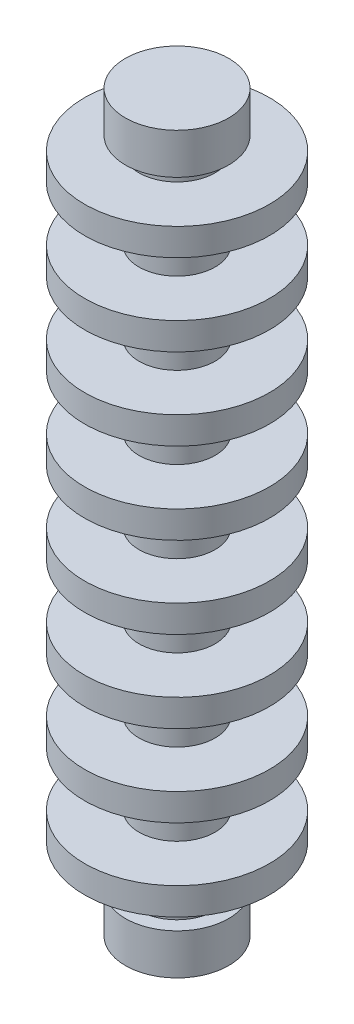
ISO-10303-21;
HEADER;
FILE_DESCRIPTION(('STEP AP214'),'2;1');
FILE_NAME('part.step','',(''),(''),'','','');
FILE_SCHEMA(('AUTOMOTIVE_DESIGN { 1 0 10303 214 1 1 1 1 }'));
ENDSEC;
DATA;
#1=APPLICATION_CONTEXT('core data for automotive mechanical design processes');
#2=APPLICATION_PROTOCOL_DEFINITION('international standard','automotive_design',2000,#1);
#3=PRODUCT_CONTEXT('',#1,'mechanical');
#4=PRODUCT('Part','Part','',(#3));
#5=PRODUCT_RELATED_PRODUCT_CATEGORY('part','',(#4));
#6=PRODUCT_DEFINITION_FORMATION('','',#4);
#7=PRODUCT_DEFINITION_CONTEXT('part definition',#1,'design');
#8=PRODUCT_DEFINITION('design','',#6,#7);
#9=PRODUCT_DEFINITION_SHAPE('','',#8);
#10=(LENGTH_UNIT() NAMED_UNIT(*) SI_UNIT(.MILLI.,.METRE.));
#11=(NAMED_UNIT(*) PLANE_ANGLE_UNIT() SI_UNIT($,.RADIAN.));
#12=(NAMED_UNIT(*) SI_UNIT($,.STERADIAN.) SOLID_ANGLE_UNIT());
#13=UNCERTAINTY_MEASURE_WITH_UNIT(LENGTH_MEASURE(1.E-05),#10,'distance_accuracy_value','');
#14=(GEOMETRIC_REPRESENTATION_CONTEXT(3) GLOBAL_UNCERTAINTY_ASSIGNED_CONTEXT((#13)) GLOBAL_UNIT_ASSIGNED_CONTEXT((#10,
#11,#12)) REPRESENTATION_CONTEXT('',''));
#15=CARTESIAN_POINT('',(0.,0.,0.));
#16=DIRECTION('',(0.,0.,1.));
#17=DIRECTION('',(1.,0.,0.));
#18=AXIS2_PLACEMENT_3D('',#15,#16,#17);
#19=CARTESIAN_POINT('',(3.8,27.,0.));
#20=DIRECTION('',(0.,-1.,0.));
#21=DIRECTION('',(1.,0.,0.));
#22=AXIS2_PLACEMENT_3D('',#19,#20,#21);
#23=PLANE('',#22);
#24=CARTESIAN_POINT('',(0.,27.,0.));
#25=DIRECTION('',(0.,1.,0.));
#26=DIRECTION('',(-1.,0.,0.));
#27=AXIS2_PLACEMENT_3D('',#24,#25,#26);
#28=CIRCLE('',#27,3.8);
#29=CARTESIAN_POINT('',(-3.8,27.,0.));
#30=VERTEX_POINT('',#29);
#31=EDGE_CURVE('E198',#30,#30,#28,.T.);
#32=ORIENTED_EDGE('',*,*,#31,.T.);
#33=EDGE_LOOP('',(#32));
#34=FACE_BOUND('',#33,.T.);
#35=ADVANCED_FACE('F43',(#34),#23,.F.);
#36=CARTESIAN_POINT('',(3.80000000000001,-27.,0.));
#37=DIRECTION('',(0.,1.,0.));
#38=DIRECTION('',(-1.,0.,0.));
#39=AXIS2_PLACEMENT_3D('',#36,#37,#38);
#40=PLANE('',#39);
#41=CARTESIAN_POINT('',(0.,-27.,0.));
#42=DIRECTION('',(0.,1.,0.));
#43=DIRECTION('',(-1.,0.,0.));
#44=AXIS2_PLACEMENT_3D('',#41,#42,#43);
#45=CIRCLE('',#44,3.8);
#46=CARTESIAN_POINT('',(-3.8,-27.,0.));
#47=VERTEX_POINT('',#46);
#48=EDGE_CURVE('E10',#47,#47,#45,.T.);
#49=ORIENTED_EDGE('',*,*,#48,.F.);
#50=EDGE_LOOP('',(#49));
#51=FACE_BOUND('',#50,.T.);
#52=ADVANCED_FACE('F421',(#51),#40,.F.);
#53=CARTESIAN_POINT('',(0.,27.,0.));
#54=DIRECTION('',(0.,1.,0.));
#55=DIRECTION('',(-1.,0.,0.));
#56=AXIS2_PLACEMENT_3D('',#53,#54,#55);
#57=CYLINDRICAL_SURFACE('',#56,3.8);
#58=CARTESIAN_POINT('',(0.,-24.,0.));
#59=DIRECTION('',(0.,1.,0.));
#60=DIRECTION('',(-1.,0.,0.));
#61=AXIS2_PLACEMENT_3D('',#58,#59,#60);
#62=CIRCLE('',#61,3.8);
#63=CARTESIAN_POINT('',(-3.8,-24.,0.));
#64=VERTEX_POINT('',#63);
#65=EDGE_CURVE('E50',#64,#64,#62,.T.);
#66=ORIENTED_EDGE('',*,*,#65,.F.);
#67=EDGE_LOOP('',(#66));
#68=FACE_BOUND('',#67,.T.);
#69=ORIENTED_EDGE('',*,*,#48,.T.);
#70=EDGE_LOOP('',(#69));
#71=FACE_BOUND('',#70,.T.);
#72=ADVANCED_FACE('F416',(#68,#71),#57,.T.);
#73=CARTESIAN_POINT('',(2.8,-24.,0.));
#74=DIRECTION('',(0.,-1.,0.));
#75=DIRECTION('',(1.,0.,0.));
#76=AXIS2_PLACEMENT_3D('',#73,#74,#75);
#77=PLANE('',#76);
#78=CARTESIAN_POINT('',(0.,-24.,0.));
#79=DIRECTION('',(0.,1.,0.));
#80=DIRECTION('',(-1.,0.,0.));
#81=AXIS2_PLACEMENT_3D('',#78,#79,#80);
#82=CIRCLE('',#81,2.8);
#83=CARTESIAN_POINT('',(-2.8,-24.,0.));
#84=VERTEX_POINT('',#83);
#85=EDGE_CURVE('E55',#84,#84,#82,.T.);
#86=ORIENTED_EDGE('',*,*,#85,.F.);
#87=EDGE_LOOP('',(#86));
#88=FACE_BOUND('',#87,.T.);
#89=ORIENTED_EDGE('',*,*,#65,.T.);
#90=EDGE_LOOP('',(#89));
#91=FACE_BOUND('',#90,.T.);
#92=ADVANCED_FACE('F411',(#88,#91),#77,.F.);
#93=CARTESIAN_POINT('',(0.,27.,0.));
#94=DIRECTION('',(0.,1.,0.));
#95=DIRECTION('',(-1.,0.,0.));
#96=AXIS2_PLACEMENT_3D('',#93,#94,#95);
#97=CYLINDRICAL_SURFACE('',#96,2.80000000000022);
#98=CARTESIAN_POINT('',(0.,-21.,0.));
#99=DIRECTION('',(0.,1.,0.));
#100=DIRECTION('',(-1.,0.,0.));
#101=AXIS2_PLACEMENT_3D('',#98,#99,#100);
#102=CIRCLE('',#101,2.80000000000043);
#103=CARTESIAN_POINT('',(-2.80000000000043,-21.,0.));
#104=VERTEX_POINT('',#103);
#105=EDGE_CURVE('E60',#104,#104,#102,.T.);
#106=ORIENTED_EDGE('',*,*,#105,.F.);
#107=EDGE_LOOP('',(#106));
#108=FACE_BOUND('',#107,.T.);
#109=ORIENTED_EDGE('',*,*,#85,.T.);
#110=EDGE_LOOP('',(#109));
#111=FACE_BOUND('',#110,.T.);
#112=ADVANCED_FACE('F405',(#108,#111),#97,.T.);
#113=CARTESIAN_POINT('',(6.80000000000044,-21.,0.));
#114=DIRECTION('',(0.,1.,0.));
#115=DIRECTION('',(-1.,0.,0.));
#116=AXIS2_PLACEMENT_3D('',#113,#114,#115);
#117=PLANE('',#116);
#118=CARTESIAN_POINT('',(0.,-21.,0.));
#119=DIRECTION('',(0.,1.,0.));
#120=DIRECTION('',(-1.,0.,0.));
#121=AXIS2_PLACEMENT_3D('',#118,#119,#120);
#122=CIRCLE('',#121,6.80000000000044);
#123=CARTESIAN_POINT('',(-6.80000000000044,-21.,0.));
#124=VERTEX_POINT('',#123);
#125=EDGE_CURVE('E66',#124,#124,#122,.T.);
#126=ORIENTED_EDGE('',*,*,#125,.F.);
#127=EDGE_LOOP('',(#126));
#128=FACE_BOUND('',#127,.T.);
#129=ORIENTED_EDGE('',*,*,#105,.T.);
#130=EDGE_LOOP('',(#129));
#131=FACE_BOUND('',#130,.T.);
#132=ADVANCED_FACE('F399',(#128,#131),#117,.F.);
#133=CARTESIAN_POINT('',(0.,27.,0.));
#134=DIRECTION('',(0.,1.,0.));
#135=DIRECTION('',(-1.,0.,0.));
#136=AXIS2_PLACEMENT_3D('',#133,#134,#135);
#137=CYLINDRICAL_SURFACE('',#136,6.80000000000044);
#138=CARTESIAN_POINT('',(0.,-19.,0.));
#139=DIRECTION('',(0.,1.,0.));
#140=DIRECTION('',(-1.,0.,0.));
#141=AXIS2_PLACEMENT_3D('',#138,#139,#140);
#142=CIRCLE('',#141,6.80000000000044);
#143=CARTESIAN_POINT('',(-6.80000000000043,-19.,0.));
#144=VERTEX_POINT('',#143);
#145=EDGE_CURVE('E70',#144,#144,#142,.T.);
#146=ORIENTED_EDGE('',*,*,#145,.F.);
#147=EDGE_LOOP('',(#146));
#148=FACE_BOUND('',#147,.T.);
#149=ORIENTED_EDGE('',*,*,#125,.T.);
#150=EDGE_LOOP('',(#149));
#151=FACE_BOUND('',#150,.T.);
#152=ADVANCED_FACE('F393',(#148,#151),#137,.T.);
#153=CARTESIAN_POINT('',(2.80000000000044,-19.,0.));
#154=DIRECTION('',(0.,-1.,0.));
#155=DIRECTION('',(1.,0.,0.));
#156=AXIS2_PLACEMENT_3D('',#153,#154,#155);
#157=PLANE('',#156);
#158=CARTESIAN_POINT('',(0.,-19.,0.));
#159=DIRECTION('',(0.,1.,0.));
#160=DIRECTION('',(-1.,0.,0.));
#161=AXIS2_PLACEMENT_3D('',#158,#159,#160);
#162=CIRCLE('',#161,2.80000000000043);
#163=CARTESIAN_POINT('',(-2.80000000000043,-19.,0.));
#164=VERTEX_POINT('',#163);
#165=EDGE_CURVE('E74',#164,#164,#162,.T.);
#166=ORIENTED_EDGE('',*,*,#165,.F.);
#167=EDGE_LOOP('',(#166));
#168=FACE_BOUND('',#167,.T.);
#169=ORIENTED_EDGE('',*,*,#145,.T.);
#170=EDGE_LOOP('',(#169));
#171=FACE_BOUND('',#170,.T.);
#172=ADVANCED_FACE('F387',(#168,#171),#157,.F.);
#173=CARTESIAN_POINT('',(0.,27.,0.));
#174=DIRECTION('',(0.,1.,0.));
#175=DIRECTION('',(-1.,0.,0.));
#176=AXIS2_PLACEMENT_3D('',#173,#174,#175);
#177=CYLINDRICAL_SURFACE('',#176,2.8000000000004);
#178=CARTESIAN_POINT('',(0.,-15.,0.));
#179=DIRECTION('',(0.,1.,0.));
#180=DIRECTION('',(-1.,0.,0.));
#181=AXIS2_PLACEMENT_3D('',#178,#179,#180);
#182=CIRCLE('',#181,2.80000000000037);
#183=CARTESIAN_POINT('',(-2.80000000000037,-15.,0.));
#184=VERTEX_POINT('',#183);
#185=EDGE_CURVE('E78',#184,#184,#182,.T.);
#186=ORIENTED_EDGE('',*,*,#185,.F.);
#187=EDGE_LOOP('',(#186));
#188=FACE_BOUND('',#187,.T.);
#189=ORIENTED_EDGE('',*,*,#165,.T.);
#190=EDGE_LOOP('',(#189));
#191=FACE_BOUND('',#190,.T.);
#192=ADVANCED_FACE('F381',(#188,#191),#177,.T.);
#193=CARTESIAN_POINT('',(6.80000000000038,-15.,0.));
#194=DIRECTION('',(0.,1.,0.));
#195=DIRECTION('',(-1.,0.,0.));
#196=AXIS2_PLACEMENT_3D('',#193,#194,#195);
#197=PLANE('',#196);
#198=CARTESIAN_POINT('',(0.,-15.,0.));
#199=DIRECTION('',(0.,1.,0.));
#200=DIRECTION('',(-1.,0.,0.));
#201=AXIS2_PLACEMENT_3D('',#198,#199,#200);
#202=CIRCLE('',#201,6.80000000000038);
#203=CARTESIAN_POINT('',(-6.80000000000037,-15.,0.));
#204=VERTEX_POINT('',#203);
#205=EDGE_CURVE('E82',#204,#204,#202,.T.);
#206=ORIENTED_EDGE('',*,*,#205,.F.);
#207=EDGE_LOOP('',(#206));
#208=FACE_BOUND('',#207,.T.);
#209=ORIENTED_EDGE('',*,*,#185,.T.);
#210=EDGE_LOOP('',(#209));
#211=FACE_BOUND('',#210,.T.);
#212=ADVANCED_FACE('F375',(#208,#211),#197,.F.);
#213=CARTESIAN_POINT('',(0.,27.,0.));
#214=DIRECTION('',(0.,1.,0.));
#215=DIRECTION('',(-1.,0.,0.));
#216=AXIS2_PLACEMENT_3D('',#213,#214,#215);
#217=CYLINDRICAL_SURFACE('',#216,6.80000000000038);
#218=CARTESIAN_POINT('',(0.,-13.,0.));
#219=DIRECTION('',(0.,1.,0.));
#220=DIRECTION('',(-1.,0.,0.));
#221=AXIS2_PLACEMENT_3D('',#218,#219,#220);
#222=CIRCLE('',#221,6.80000000000037);
#223=CARTESIAN_POINT('',(-6.80000000000037,-13.,0.));
#224=VERTEX_POINT('',#223);
#225=EDGE_CURVE('E86',#224,#224,#222,.T.);
#226=ORIENTED_EDGE('',*,*,#225,.F.);
#227=EDGE_LOOP('',(#226));
#228=FACE_BOUND('',#227,.T.);
#229=ORIENTED_EDGE('',*,*,#205,.T.);
#230=EDGE_LOOP('',(#229));
#231=FACE_BOUND('',#230,.T.);
#232=ADVANCED_FACE('F369',(#228,#231),#217,.T.);
#233=CARTESIAN_POINT('',(2.80000000000037,-13.,0.));
#234=DIRECTION('',(0.,-1.,0.));
#235=DIRECTION('',(1.,0.,0.));
#236=AXIS2_PLACEMENT_3D('',#233,#234,#235);
#237=PLANE('',#236);
#238=CARTESIAN_POINT('',(0.,-13.,0.));
#239=DIRECTION('',(0.,1.,0.));
#240=DIRECTION('',(-1.,0.,0.));
#241=AXIS2_PLACEMENT_3D('',#238,#239,#240);
#242=CIRCLE('',#241,2.80000000000037);
#243=CARTESIAN_POINT('',(-2.80000000000037,-13.,0.));
#244=VERTEX_POINT('',#243);
#245=EDGE_CURVE('E90',#244,#244,#242,.T.);
#246=ORIENTED_EDGE('',*,*,#245,.F.);
#247=EDGE_LOOP('',(#246));
#248=FACE_BOUND('',#247,.T.);
#249=ORIENTED_EDGE('',*,*,#225,.T.);
#250=EDGE_LOOP('',(#249));
#251=FACE_BOUND('',#250,.T.);
#252=ADVANCED_FACE('F363',(#248,#251),#237,.F.);
#253=CARTESIAN_POINT('',(0.,27.,0.));
#254=DIRECTION('',(0.,1.,0.));
#255=DIRECTION('',(-1.,0.,0.));
#256=AXIS2_PLACEMENT_3D('',#253,#254,#255);
#257=CYLINDRICAL_SURFACE('',#256,2.80000000000034);
#258=CARTESIAN_POINT('',(0.,-9.,0.));
#259=DIRECTION('',(0.,1.,0.));
#260=DIRECTION('',(-1.,0.,0.));
#261=AXIS2_PLACEMENT_3D('',#258,#259,#260);
#262=CIRCLE('',#261,2.80000000000031);
#263=CARTESIAN_POINT('',(-2.80000000000031,-9.,0.));
#264=VERTEX_POINT('',#263);
#265=EDGE_CURVE('E94',#264,#264,#262,.T.);
#266=ORIENTED_EDGE('',*,*,#265,.F.);
#267=EDGE_LOOP('',(#266));
#268=FACE_BOUND('',#267,.T.);
#269=ORIENTED_EDGE('',*,*,#245,.T.);
#270=EDGE_LOOP('',(#269));
#271=FACE_BOUND('',#270,.T.);
#272=ADVANCED_FACE('F357',(#268,#271),#257,.T.);
#273=CARTESIAN_POINT('',(6.80000000000032,-9.,0.));
#274=DIRECTION('',(0.,1.,0.));
#275=DIRECTION('',(-1.,0.,0.));
#276=AXIS2_PLACEMENT_3D('',#273,#274,#275);
#277=PLANE('',#276);
#278=CARTESIAN_POINT('',(0.,-9.,0.));
#279=DIRECTION('',(0.,1.,0.));
#280=DIRECTION('',(-1.,0.,0.));
#281=AXIS2_PLACEMENT_3D('',#278,#279,#280);
#282=CIRCLE('',#281,6.80000000000031);
#283=CARTESIAN_POINT('',(-6.80000000000031,-9.,0.));
#284=VERTEX_POINT('',#283);
#285=EDGE_CURVE('E98',#284,#284,#282,.T.);
#286=ORIENTED_EDGE('',*,*,#285,.F.);
#287=EDGE_LOOP('',(#286));
#288=FACE_BOUND('',#287,.T.);
#289=ORIENTED_EDGE('',*,*,#265,.T.);
#290=EDGE_LOOP('',(#289));
#291=FACE_BOUND('',#290,.T.);
#292=ADVANCED_FACE('F351',(#288,#291),#277,.F.);
#293=CARTESIAN_POINT('',(0.,27.,0.));
#294=DIRECTION('',(0.,1.,0.));
#295=DIRECTION('',(-1.,0.,0.));
#296=AXIS2_PLACEMENT_3D('',#293,#294,#295);
#297=CYLINDRICAL_SURFACE('',#296,6.80000000000031);
#298=CARTESIAN_POINT('',(0.,-7.,0.));
#299=DIRECTION('',(0.,1.,0.));
#300=DIRECTION('',(-1.,0.,0.));
#301=AXIS2_PLACEMENT_3D('',#298,#299,#300);
#302=CIRCLE('',#301,6.80000000000031);
#303=CARTESIAN_POINT('',(-6.80000000000031,-7.,0.));
#304=VERTEX_POINT('',#303);
#305=EDGE_CURVE('E102',#304,#304,#302,.T.);
#306=ORIENTED_EDGE('',*,*,#305,.F.);
#307=EDGE_LOOP('',(#306));
#308=FACE_BOUND('',#307,.T.);
#309=ORIENTED_EDGE('',*,*,#285,.T.);
#310=EDGE_LOOP('',(#309));
#311=FACE_BOUND('',#310,.T.);
#312=ADVANCED_FACE('F345',(#308,#311),#297,.T.);
#313=CARTESIAN_POINT('',(2.80000000000031,-7.,0.));
#314=DIRECTION('',(0.,-1.,0.));
#315=DIRECTION('',(1.,0.,0.));
#316=AXIS2_PLACEMENT_3D('',#313,#314,#315);
#317=PLANE('',#316);
#318=CARTESIAN_POINT('',(0.,-7.,0.));
#319=DIRECTION('',(0.,1.,0.));
#320=DIRECTION('',(-1.,0.,0.));
#321=AXIS2_PLACEMENT_3D('',#318,#319,#320);
#322=CIRCLE('',#321,2.80000000000031);
#323=CARTESIAN_POINT('',(-2.80000000000031,-7.,0.));
#324=VERTEX_POINT('',#323);
#325=EDGE_CURVE('E106',#324,#324,#322,.T.);
#326=ORIENTED_EDGE('',*,*,#325,.F.);
#327=EDGE_LOOP('',(#326));
#328=FACE_BOUND('',#327,.T.);
#329=ORIENTED_EDGE('',*,*,#305,.T.);
#330=EDGE_LOOP('',(#329));
#331=FACE_BOUND('',#330,.T.);
#332=ADVANCED_FACE('F339',(#328,#331),#317,.F.);
#333=CARTESIAN_POINT('',(0.,27.,0.));
#334=DIRECTION('',(0.,1.,0.));
#335=DIRECTION('',(-1.,0.,0.));
#336=AXIS2_PLACEMENT_3D('',#333,#334,#335);
#337=CYLINDRICAL_SURFACE('',#336,2.80000000000028);
#338=CARTESIAN_POINT('',(0.,-3.,0.));
#339=DIRECTION('',(0.,1.,0.));
#340=DIRECTION('',(-1.,0.,0.));
#341=AXIS2_PLACEMENT_3D('',#338,#339,#340);
#342=CIRCLE('',#341,2.80000000000025);
#343=CARTESIAN_POINT('',(-2.80000000000025,-3.,0.));
#344=VERTEX_POINT('',#343);
#345=EDGE_CURVE('E110',#344,#344,#342,.T.);
#346=ORIENTED_EDGE('',*,*,#345,.F.);
#347=EDGE_LOOP('',(#346));
#348=FACE_BOUND('',#347,.T.);
#349=ORIENTED_EDGE('',*,*,#325,.T.);
#350=EDGE_LOOP('',(#349));
#351=FACE_BOUND('',#350,.T.);
#352=ADVANCED_FACE('F333',(#348,#351),#337,.T.);
#353=CARTESIAN_POINT('',(6.80000000000025,-3.,0.));
#354=DIRECTION('',(0.,1.,0.));
#355=DIRECTION('',(-1.,0.,0.));
#356=AXIS2_PLACEMENT_3D('',#353,#354,#355);
#357=PLANE('',#356);
#358=CARTESIAN_POINT('',(0.,-3.,0.));
#359=DIRECTION('',(0.,1.,0.));
#360=DIRECTION('',(-1.,0.,0.));
#361=AXIS2_PLACEMENT_3D('',#358,#359,#360);
#362=CIRCLE('',#361,6.80000000000025);
#363=CARTESIAN_POINT('',(-6.80000000000025,-3.,0.));
#364=VERTEX_POINT('',#363);
#365=EDGE_CURVE('E114',#364,#364,#362,.T.);
#366=ORIENTED_EDGE('',*,*,#365,.F.);
#367=EDGE_LOOP('',(#366));
#368=FACE_BOUND('',#367,.T.);
#369=ORIENTED_EDGE('',*,*,#345,.T.);
#370=EDGE_LOOP('',(#369));
#371=FACE_BOUND('',#370,.T.);
#372=ADVANCED_FACE('F327',(#368,#371),#357,.F.);
#373=CARTESIAN_POINT('',(0.,27.,0.));
#374=DIRECTION('',(0.,1.,0.));
#375=DIRECTION('',(-1.,0.,0.));
#376=AXIS2_PLACEMENT_3D('',#373,#374,#375);
#377=CYLINDRICAL_SURFACE('',#376,6.80000000000025);
#378=CARTESIAN_POINT('',(0.,-1.,0.));
#379=DIRECTION('',(0.,1.,0.));
#380=DIRECTION('',(-1.,0.,0.));
#381=AXIS2_PLACEMENT_3D('',#378,#379,#380);
#382=CIRCLE('',#381,6.80000000000025);
#383=CARTESIAN_POINT('',(-6.80000000000025,-1.,0.));
#384=VERTEX_POINT('',#383);
#385=EDGE_CURVE('E118',#384,#384,#382,.T.);
#386=ORIENTED_EDGE('',*,*,#385,.F.);
#387=EDGE_LOOP('',(#386));
#388=FACE_BOUND('',#387,.T.);
#389=ORIENTED_EDGE('',*,*,#365,.T.);
#390=EDGE_LOOP('',(#389));
#391=FACE_BOUND('',#390,.T.);
#392=ADVANCED_FACE('F321',(#388,#391),#377,.T.);
#393=CARTESIAN_POINT('',(2.80000000000025,-1.,0.));
#394=DIRECTION('',(0.,-1.,0.));
#395=DIRECTION('',(1.,0.,0.));
#396=AXIS2_PLACEMENT_3D('',#393,#394,#395);
#397=PLANE('',#396);
#398=CARTESIAN_POINT('',(0.,-1.,0.));
#399=DIRECTION('',(0.,1.,0.));
#400=DIRECTION('',(-1.,0.,0.));
#401=AXIS2_PLACEMENT_3D('',#398,#399,#400);
#402=CIRCLE('',#401,2.80000000000025);
#403=CARTESIAN_POINT('',(-2.80000000000025,-1.,0.));
#404=VERTEX_POINT('',#403);
#405=EDGE_CURVE('E122',#404,#404,#402,.T.);
#406=ORIENTED_EDGE('',*,*,#405,.F.);
#407=EDGE_LOOP('',(#406));
#408=FACE_BOUND('',#407,.T.);
#409=ORIENTED_EDGE('',*,*,#385,.T.);
#410=EDGE_LOOP('',(#409));
#411=FACE_BOUND('',#410,.T.);
#412=ADVANCED_FACE('F315',(#408,#411),#397,.F.);
#413=CARTESIAN_POINT('',(0.,27.,0.));
#414=DIRECTION('',(0.,1.,0.));
#415=DIRECTION('',(-1.,0.,0.));
#416=AXIS2_PLACEMENT_3D('',#413,#414,#415);
#417=CYLINDRICAL_SURFACE('',#416,2.80000000000022);
#418=CARTESIAN_POINT('',(0.,3.,0.));
#419=DIRECTION('',(0.,1.,0.));
#420=DIRECTION('',(-1.,0.,0.));
#421=AXIS2_PLACEMENT_3D('',#418,#419,#420);
#422=CIRCLE('',#421,2.80000000000019);
#423=CARTESIAN_POINT('',(-2.80000000000018,3.,0.));
#424=VERTEX_POINT('',#423);
#425=EDGE_CURVE('E126',#424,#424,#422,.T.);
#426=ORIENTED_EDGE('',*,*,#425,.F.);
#427=EDGE_LOOP('',(#426));
#428=FACE_BOUND('',#427,.T.);
#429=ORIENTED_EDGE('',*,*,#405,.T.);
#430=EDGE_LOOP('',(#429));
#431=FACE_BOUND('',#430,.T.);
#432=ADVANCED_FACE('F309',(#428,#431),#417,.T.);
#433=CARTESIAN_POINT('',(6.80000000000019,3.,0.));
#434=DIRECTION('',(0.,1.,0.));
#435=DIRECTION('',(-1.,0.,0.));
#436=AXIS2_PLACEMENT_3D('',#433,#434,#435);
#437=PLANE('',#436);
#438=CARTESIAN_POINT('',(0.,3.,0.));
#439=DIRECTION('',(0.,1.,0.));
#440=DIRECTION('',(-1.,0.,0.));
#441=AXIS2_PLACEMENT_3D('',#438,#439,#440);
#442=CIRCLE('',#441,6.80000000000019);
#443=CARTESIAN_POINT('',(-6.80000000000019,3.,0.));
#444=VERTEX_POINT('',#443);
#445=EDGE_CURVE('E130',#444,#444,#442,.T.);
#446=ORIENTED_EDGE('',*,*,#445,.F.);
#447=EDGE_LOOP('',(#446));
#448=FACE_BOUND('',#447,.T.);
#449=ORIENTED_EDGE('',*,*,#425,.T.);
#450=EDGE_LOOP('',(#449));
#451=FACE_BOUND('',#450,.T.);
#452=ADVANCED_FACE('F303',(#448,#451),#437,.F.);
#453=CARTESIAN_POINT('',(0.,27.,0.));
#454=DIRECTION('',(0.,1.,0.));
#455=DIRECTION('',(-1.,0.,0.));
#456=AXIS2_PLACEMENT_3D('',#453,#454,#455);
#457=CYLINDRICAL_SURFACE('',#456,6.80000000000019);
#458=CARTESIAN_POINT('',(0.,5.,0.));
#459=DIRECTION('',(0.,1.,0.));
#460=DIRECTION('',(-1.,0.,0.));
#461=AXIS2_PLACEMENT_3D('',#458,#459,#460);
#462=CIRCLE('',#461,6.80000000000019);
#463=CARTESIAN_POINT('',(-6.80000000000019,5.,0.));
#464=VERTEX_POINT('',#463);
#465=EDGE_CURVE('E134',#464,#464,#462,.T.);
#466=ORIENTED_EDGE('',*,*,#465,.F.);
#467=EDGE_LOOP('',(#466));
#468=FACE_BOUND('',#467,.T.);
#469=ORIENTED_EDGE('',*,*,#445,.T.);
#470=EDGE_LOOP('',(#469));
#471=FACE_BOUND('',#470,.T.);
#472=ADVANCED_FACE('F297',(#468,#471),#457,.T.);
#473=CARTESIAN_POINT('',(2.80000000000019,5.,0.));
#474=DIRECTION('',(0.,-1.,0.));
#475=DIRECTION('',(1.,0.,0.));
#476=AXIS2_PLACEMENT_3D('',#473,#474,#475);
#477=PLANE('',#476);
#478=CARTESIAN_POINT('',(0.,5.,0.));
#479=DIRECTION('',(0.,1.,0.));
#480=DIRECTION('',(-1.,0.,0.));
#481=AXIS2_PLACEMENT_3D('',#478,#479,#480);
#482=CIRCLE('',#481,2.80000000000019);
#483=CARTESIAN_POINT('',(-2.80000000000018,5.,0.));
#484=VERTEX_POINT('',#483);
#485=EDGE_CURVE('E138',#484,#484,#482,.T.);
#486=ORIENTED_EDGE('',*,*,#485,.F.);
#487=EDGE_LOOP('',(#486));
#488=FACE_BOUND('',#487,.T.);
#489=ORIENTED_EDGE('',*,*,#465,.T.);
#490=EDGE_LOOP('',(#489));
#491=FACE_BOUND('',#490,.T.);
#492=ADVANCED_FACE('F291',(#488,#491),#477,.F.);
#493=CARTESIAN_POINT('',(0.,27.,0.));
#494=DIRECTION('',(0.,1.,0.));
#495=DIRECTION('',(-1.,0.,0.));
#496=AXIS2_PLACEMENT_3D('',#493,#494,#495);
#497=CYLINDRICAL_SURFACE('',#496,2.80000000000015);
#498=CARTESIAN_POINT('',(0.,8.99999999999999,0.));
#499=DIRECTION('',(0.,1.,0.));
#500=DIRECTION('',(-1.,0.,0.));
#501=AXIS2_PLACEMENT_3D('',#498,#499,#500);
#502=CIRCLE('',#501,2.80000000000012);
#503=CARTESIAN_POINT('',(-2.80000000000012,8.99999999999999,0.));
#504=VERTEX_POINT('',#503);
#505=EDGE_CURVE('E142',#504,#504,#502,.T.);
#506=ORIENTED_EDGE('',*,*,#505,.F.);
#507=EDGE_LOOP('',(#506));
#508=FACE_BOUND('',#507,.T.);
#509=ORIENTED_EDGE('',*,*,#485,.T.);
#510=EDGE_LOOP('',(#509));
#511=FACE_BOUND('',#510,.T.);
#512=ADVANCED_FACE('F285',(#508,#511),#497,.T.);
#513=CARTESIAN_POINT('',(6.80000000000013,9.,0.));
#514=DIRECTION('',(0.,1.,0.));
#515=DIRECTION('',(-1.,0.,0.));
#516=AXIS2_PLACEMENT_3D('',#513,#514,#515);
#517=PLANE('',#516);
#518=CARTESIAN_POINT('',(0.,9.,0.));
#519=DIRECTION('',(0.,1.,0.));
#520=DIRECTION('',(-1.,0.,0.));
#521=AXIS2_PLACEMENT_3D('',#518,#519,#520);
#522=CIRCLE('',#521,6.80000000000013);
#523=CARTESIAN_POINT('',(-6.80000000000013,9.,0.));
#524=VERTEX_POINT('',#523);
#525=EDGE_CURVE('E146',#524,#524,#522,.T.);
#526=ORIENTED_EDGE('',*,*,#525,.F.);
#527=EDGE_LOOP('',(#526));
#528=FACE_BOUND('',#527,.T.);
#529=ORIENTED_EDGE('',*,*,#505,.T.);
#530=EDGE_LOOP('',(#529));
#531=FACE_BOUND('',#530,.T.);
#532=ADVANCED_FACE('F279',(#528,#531),#517,.F.);
#533=CARTESIAN_POINT('',(0.,27.,0.));
#534=DIRECTION('',(0.,1.,0.));
#535=DIRECTION('',(-1.,0.,0.));
#536=AXIS2_PLACEMENT_3D('',#533,#534,#535);
#537=CYLINDRICAL_SURFACE('',#536,6.80000000000013);
#538=CARTESIAN_POINT('',(0.,11.,0.));
#539=DIRECTION('',(0.,1.,0.));
#540=DIRECTION('',(-1.,0.,0.));
#541=AXIS2_PLACEMENT_3D('',#538,#539,#540);
#542=CIRCLE('',#541,6.80000000000013);
#543=CARTESIAN_POINT('',(-6.80000000000013,11.,0.));
#544=VERTEX_POINT('',#543);
#545=EDGE_CURVE('E150',#544,#544,#542,.T.);
#546=ORIENTED_EDGE('',*,*,#545,.F.);
#547=EDGE_LOOP('',(#546));
#548=FACE_BOUND('',#547,.T.);
#549=ORIENTED_EDGE('',*,*,#525,.T.);
#550=EDGE_LOOP('',(#549));
#551=FACE_BOUND('',#550,.T.);
#552=ADVANCED_FACE('F273',(#548,#551),#537,.T.);
#553=CARTESIAN_POINT('',(2.80000000000012,11.,0.));
#554=DIRECTION('',(0.,-1.,0.));
#555=DIRECTION('',(1.,0.,0.));
#556=AXIS2_PLACEMENT_3D('',#553,#554,#555);
#557=PLANE('',#556);
#558=CARTESIAN_POINT('',(0.,11.,0.));
#559=DIRECTION('',(0.,1.,0.));
#560=DIRECTION('',(-1.,0.,0.));
#561=AXIS2_PLACEMENT_3D('',#558,#559,#560);
#562=CIRCLE('',#561,2.80000000000012);
#563=CARTESIAN_POINT('',(-2.80000000000012,11.,0.));
#564=VERTEX_POINT('',#563);
#565=EDGE_CURVE('E154',#564,#564,#562,.T.);
#566=ORIENTED_EDGE('',*,*,#565,.F.);
#567=EDGE_LOOP('',(#566));
#568=FACE_BOUND('',#567,.T.);
#569=ORIENTED_EDGE('',*,*,#545,.T.);
#570=EDGE_LOOP('',(#569));
#571=FACE_BOUND('',#570,.T.);
#572=ADVANCED_FACE('F267',(#568,#571),#557,.F.);
#573=CARTESIAN_POINT('',(0.,27.,0.));
#574=DIRECTION('',(0.,1.,0.));
#575=DIRECTION('',(-1.,0.,0.));
#576=AXIS2_PLACEMENT_3D('',#573,#574,#575);
#577=CYLINDRICAL_SURFACE('',#576,2.80000000000009);
#578=CARTESIAN_POINT('',(0.,15.,0.));
#579=DIRECTION('',(0.,1.,0.));
#580=DIRECTION('',(-1.,0.,0.));
#581=AXIS2_PLACEMENT_3D('',#578,#579,#580);
#582=CIRCLE('',#581,2.80000000000006);
#583=CARTESIAN_POINT('',(-2.80000000000006,15.,0.));
#584=VERTEX_POINT('',#583);
#585=EDGE_CURVE('E158',#584,#584,#582,.T.);
#586=ORIENTED_EDGE('',*,*,#585,.F.);
#587=EDGE_LOOP('',(#586));
#588=FACE_BOUND('',#587,.T.);
#589=ORIENTED_EDGE('',*,*,#565,.T.);
#590=EDGE_LOOP('',(#589));
#591=FACE_BOUND('',#590,.T.);
#592=ADVANCED_FACE('F261',(#588,#591),#577,.T.);
#593=CARTESIAN_POINT('',(6.80000000000007,15.,0.));
#594=DIRECTION('',(0.,1.,0.));
#595=DIRECTION('',(-1.,0.,0.));
#596=AXIS2_PLACEMENT_3D('',#593,#594,#595);
#597=PLANE('',#596);
#598=CARTESIAN_POINT('',(0.,15.,0.));
#599=DIRECTION('',(0.,1.,0.));
#600=DIRECTION('',(-1.,0.,0.));
#601=AXIS2_PLACEMENT_3D('',#598,#599,#600);
#602=CIRCLE('',#601,6.80000000000007);
#603=CARTESIAN_POINT('',(-6.80000000000006,15.,0.));
#604=VERTEX_POINT('',#603);
#605=EDGE_CURVE('E162',#604,#604,#602,.T.);
#606=ORIENTED_EDGE('',*,*,#605,.F.);
#607=EDGE_LOOP('',(#606));
#608=FACE_BOUND('',#607,.T.);
#609=ORIENTED_EDGE('',*,*,#585,.T.);
#610=EDGE_LOOP('',(#609));
#611=FACE_BOUND('',#610,.T.);
#612=ADVANCED_FACE('F255',(#608,#611),#597,.F.);
#613=CARTESIAN_POINT('',(0.,27.,0.));
#614=DIRECTION('',(0.,1.,0.));
#615=DIRECTION('',(-1.,0.,0.));
#616=AXIS2_PLACEMENT_3D('',#613,#614,#615);
#617=CYLINDRICAL_SURFACE('',#616,6.80000000000006);
#618=CARTESIAN_POINT('',(0.,17.,0.));
#619=DIRECTION('',(0.,1.,0.));
#620=DIRECTION('',(-1.,0.,0.));
#621=AXIS2_PLACEMENT_3D('',#618,#619,#620);
#622=CIRCLE('',#621,6.80000000000006);
#623=CARTESIAN_POINT('',(-6.80000000000006,17.,0.));
#624=VERTEX_POINT('',#623);
#625=EDGE_CURVE('E166',#624,#624,#622,.T.);
#626=ORIENTED_EDGE('',*,*,#625,.F.);
#627=EDGE_LOOP('',(#626));
#628=FACE_BOUND('',#627,.T.);
#629=ORIENTED_EDGE('',*,*,#605,.T.);
#630=EDGE_LOOP('',(#629));
#631=FACE_BOUND('',#630,.T.);
#632=ADVANCED_FACE('F249',(#628,#631),#617,.T.);
#633=CARTESIAN_POINT('',(2.80000000000006,17.,0.));
#634=DIRECTION('',(0.,-1.,0.));
#635=DIRECTION('',(1.,0.,0.));
#636=AXIS2_PLACEMENT_3D('',#633,#634,#635);
#637=PLANE('',#636);
#638=CARTESIAN_POINT('',(0.,17.,0.));
#639=DIRECTION('',(0.,1.,0.));
#640=DIRECTION('',(-1.,0.,0.));
#641=AXIS2_PLACEMENT_3D('',#638,#639,#640);
#642=CIRCLE('',#641,2.80000000000006);
#643=CARTESIAN_POINT('',(-2.80000000000006,17.,0.));
#644=VERTEX_POINT('',#643);
#645=EDGE_CURVE('E170',#644,#644,#642,.T.);
#646=ORIENTED_EDGE('',*,*,#645,.F.);
#647=EDGE_LOOP('',(#646));
#648=FACE_BOUND('',#647,.T.);
#649=ORIENTED_EDGE('',*,*,#625,.T.);
#650=EDGE_LOOP('',(#649));
#651=FACE_BOUND('',#650,.T.);
#652=ADVANCED_FACE('F243',(#648,#651),#637,.F.);
#653=CARTESIAN_POINT('',(0.,27.,0.));
#654=DIRECTION('',(0.,1.,0.));
#655=DIRECTION('',(-1.,0.,0.));
#656=AXIS2_PLACEMENT_3D('',#653,#654,#655);
#657=CYLINDRICAL_SURFACE('',#656,2.79999999999978);
#658=CARTESIAN_POINT('',(0.,21.,0.));
#659=DIRECTION('',(0.,1.,0.));
#660=DIRECTION('',(-1.,0.,0.));
#661=AXIS2_PLACEMENT_3D('',#658,#659,#660);
#662=CIRCLE('',#661,2.8);
#663=CARTESIAN_POINT('',(-2.8,21.,0.));
#664=VERTEX_POINT('',#663);
#665=EDGE_CURVE('E174',#664,#664,#662,.T.);
#666=ORIENTED_EDGE('',*,*,#665,.F.);
#667=EDGE_LOOP('',(#666));
#668=FACE_BOUND('',#667,.T.);
#669=ORIENTED_EDGE('',*,*,#645,.T.);
#670=EDGE_LOOP('',(#669));
#671=FACE_BOUND('',#670,.T.);
#672=ADVANCED_FACE('F237',(#668,#671),#657,.T.);
#673=CARTESIAN_POINT('',(6.8,21.,0.));
#674=DIRECTION('',(0.,1.,0.));
#675=DIRECTION('',(-1.,0.,0.));
#676=AXIS2_PLACEMENT_3D('',#673,#674,#675);
#677=PLANE('',#676);
#678=CARTESIAN_POINT('',(0.,21.,0.));
#679=DIRECTION('',(0.,1.,0.));
#680=DIRECTION('',(-1.,0.,0.));
#681=AXIS2_PLACEMENT_3D('',#678,#679,#680);
#682=CIRCLE('',#681,6.8);
#683=CARTESIAN_POINT('',(-6.8,21.,0.));
#684=VERTEX_POINT('',#683);
#685=EDGE_CURVE('E178',#684,#684,#682,.T.);
#686=ORIENTED_EDGE('',*,*,#685,.F.);
#687=EDGE_LOOP('',(#686));
#688=FACE_BOUND('',#687,.T.);
#689=ORIENTED_EDGE('',*,*,#665,.T.);
#690=EDGE_LOOP('',(#689));
#691=FACE_BOUND('',#690,.T.);
#692=ADVANCED_FACE('F231',(#688,#691),#677,.F.);
#693=CARTESIAN_POINT('',(0.,27.,0.));
#694=DIRECTION('',(0.,1.,0.));
#695=DIRECTION('',(-1.,0.,0.));
#696=AXIS2_PLACEMENT_3D('',#693,#694,#695);
#697=CYLINDRICAL_SURFACE('',#696,6.8);
#698=CARTESIAN_POINT('',(0.,23.,0.));
#699=DIRECTION('',(0.,1.,0.));
#700=DIRECTION('',(-1.,0.,0.));
#701=AXIS2_PLACEMENT_3D('',#698,#699,#700);
#702=CIRCLE('',#701,6.8);
#703=CARTESIAN_POINT('',(-6.8,23.,0.));
#704=VERTEX_POINT('',#703);
#705=EDGE_CURVE('E182',#704,#704,#702,.T.);
#706=ORIENTED_EDGE('',*,*,#705,.F.);
#707=EDGE_LOOP('',(#706));
#708=FACE_BOUND('',#707,.T.);
#709=ORIENTED_EDGE('',*,*,#685,.T.);
#710=EDGE_LOOP('',(#709));
#711=FACE_BOUND('',#710,.T.);
#712=ADVANCED_FACE('F225',(#708,#711),#697,.T.);
#713=CARTESIAN_POINT('',(2.8,23.,0.));
#714=DIRECTION('',(0.,-1.,0.));
#715=DIRECTION('',(1.,0.,0.));
#716=AXIS2_PLACEMENT_3D('',#713,#714,#715);
#717=PLANE('',#716);
#718=CARTESIAN_POINT('',(0.,23.,0.));
#719=DIRECTION('',(0.,1.,0.));
#720=DIRECTION('',(-1.,0.,0.));
#721=AXIS2_PLACEMENT_3D('',#718,#719,#720);
#722=CIRCLE('',#721,2.8);
#723=CARTESIAN_POINT('',(-2.8,23.,0.));
#724=VERTEX_POINT('',#723);
#725=EDGE_CURVE('E186',#724,#724,#722,.T.);
#726=ORIENTED_EDGE('',*,*,#725,.F.);
#727=EDGE_LOOP('',(#726));
#728=FACE_BOUND('',#727,.T.);
#729=ORIENTED_EDGE('',*,*,#705,.T.);
#730=EDGE_LOOP('',(#729));
#731=FACE_BOUND('',#730,.T.);
#732=ADVANCED_FACE('F219',(#728,#731),#717,.F.);
#733=CARTESIAN_POINT('',(0.,27.,0.));
#734=DIRECTION('',(0.,1.,0.));
#735=DIRECTION('',(-1.,0.,0.));
#736=AXIS2_PLACEMENT_3D('',#733,#734,#735);
#737=CYLINDRICAL_SURFACE('',#736,2.8);
#738=CARTESIAN_POINT('',(0.,24.,0.));
#739=DIRECTION('',(0.,1.,0.));
#740=DIRECTION('',(-1.,0.,0.));
#741=AXIS2_PLACEMENT_3D('',#738,#739,#740);
#742=CIRCLE('',#741,2.8);
#743=CARTESIAN_POINT('',(-2.8,24.,0.));
#744=VERTEX_POINT('',#743);
#745=EDGE_CURVE('E190',#744,#744,#742,.T.);
#746=ORIENTED_EDGE('',*,*,#745,.F.);
#747=EDGE_LOOP('',(#746));
#748=FACE_BOUND('',#747,.T.);
#749=ORIENTED_EDGE('',*,*,#725,.T.);
#750=EDGE_LOOP('',(#749));
#751=FACE_BOUND('',#750,.T.);
#752=ADVANCED_FACE('F213',(#748,#751),#737,.T.);
#753=CARTESIAN_POINT('',(2.8,24.,0.));
#754=DIRECTION('',(0.,1.,0.));
#755=DIRECTION('',(-1.,0.,0.));
#756=AXIS2_PLACEMENT_3D('',#753,#754,#755);
#757=PLANE('',#756);
#758=CARTESIAN_POINT('',(0.,24.,0.));
#759=DIRECTION('',(0.,1.,0.));
#760=DIRECTION('',(-1.,0.,0.));
#761=AXIS2_PLACEMENT_3D('',#758,#759,#760);
#762=CIRCLE('',#761,3.8);
#763=CARTESIAN_POINT('',(-3.8,24.,0.));
#764=VERTEX_POINT('',#763);
#765=EDGE_CURVE('E194',#764,#764,#762,.T.);
#766=ORIENTED_EDGE('',*,*,#765,.F.);
#767=EDGE_LOOP('',(#766));
#768=FACE_BOUND('',#767,.T.);
#769=ORIENTED_EDGE('',*,*,#745,.T.);
#770=EDGE_LOOP('',(#769));
#771=FACE_BOUND('',#770,.T.);
#772=ADVANCED_FACE('F207',(#768,#771),#757,.F.);
#773=CARTESIAN_POINT('',(0.,27.,0.));
#774=DIRECTION('',(0.,1.,0.));
#775=DIRECTION('',(-1.,0.,0.));
#776=AXIS2_PLACEMENT_3D('',#773,#774,#775);
#777=CYLINDRICAL_SURFACE('',#776,3.8);
#778=ORIENTED_EDGE('',*,*,#31,.F.);
#779=EDGE_LOOP('',(#778));
#780=FACE_BOUND('',#779,.T.);
#781=ORIENTED_EDGE('',*,*,#765,.T.);
#782=EDGE_LOOP('',(#781));
#783=FACE_BOUND('',#782,.T.);
#784=ADVANCED_FACE('F204',(#780,#783),#777,.T.);
#785=CLOSED_SHELL('',(#35,#52,#72,#92,#112,#132,#152,#172,#192,#212,#232,#252,#272,#292,#312,
#332,#352,#372,#392,#412,#432,#452,#472,#492,#512,#532,#552,#572,#592,#612,#632,#652,#672,#692,
#712,#732,#752,#772,#784));
#786=MANIFOLD_SOLID_BREP('B2',#785);
#787=ADVANCED_BREP_SHAPE_REPRESENTATION('',(#18,#786),#14);
#788=SHAPE_DEFINITION_REPRESENTATION(#9,#787);
ENDSEC;
END-ISO-10303-21;
